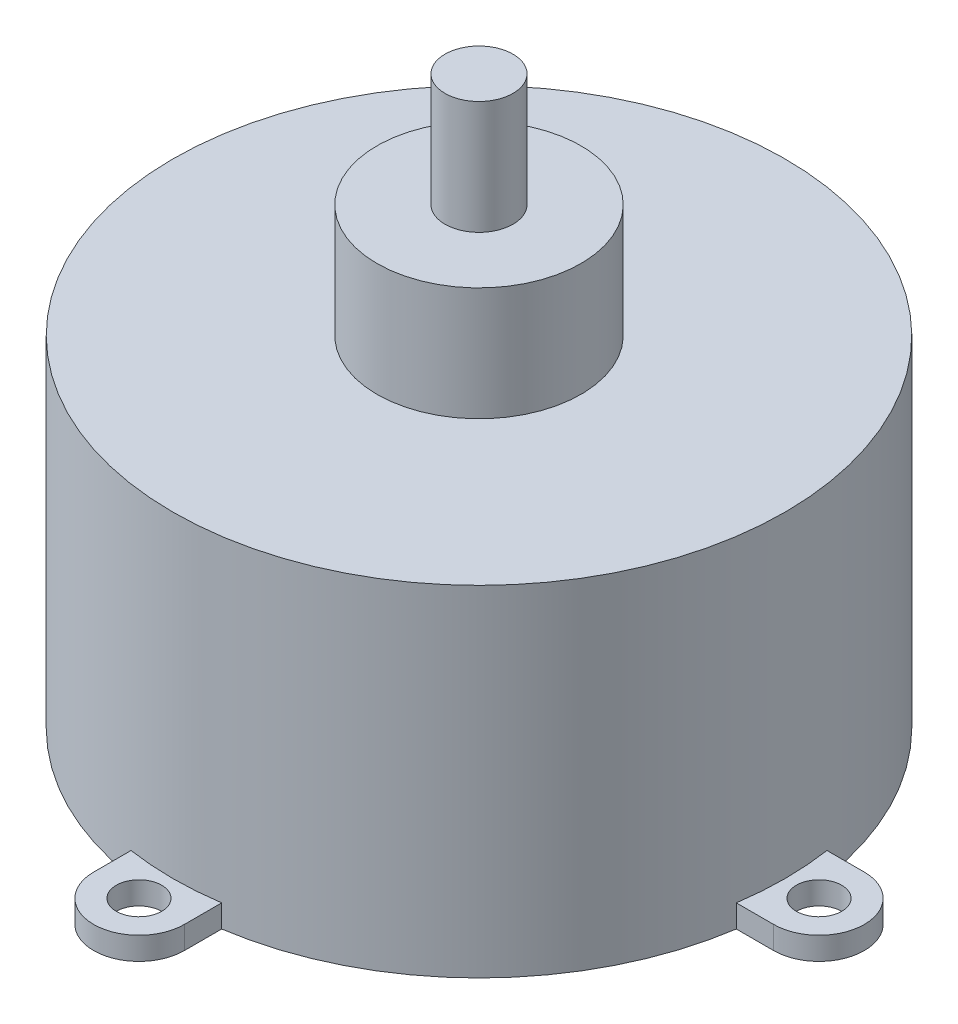
ISO-10303-21;
HEADER;
FILE_DESCRIPTION(('STEP AP214'),'2;1');
FILE_NAME('part.step','',(''),(''),'','','');
FILE_SCHEMA(('AUTOMOTIVE_DESIGN { 1 0 10303 214 1 1 1 1 }'));
ENDSEC;
DATA;
#1=APPLICATION_CONTEXT('core data for automotive mechanical design processes');
#2=APPLICATION_PROTOCOL_DEFINITION('international standard','automotive_design',2000,#1);
#3=PRODUCT_CONTEXT('',#1,'mechanical');
#4=PRODUCT('Part','Part','',(#3));
#5=PRODUCT_RELATED_PRODUCT_CATEGORY('part','',(#4));
#6=PRODUCT_DEFINITION_FORMATION('','',#4);
#7=PRODUCT_DEFINITION_CONTEXT('part definition',#1,'design');
#8=PRODUCT_DEFINITION('design','',#6,#7);
#9=PRODUCT_DEFINITION_SHAPE('','',#8);
#10=(LENGTH_UNIT() NAMED_UNIT(*) SI_UNIT(.MILLI.,.METRE.));
#11=(NAMED_UNIT(*) PLANE_ANGLE_UNIT() SI_UNIT($,.RADIAN.));
#12=(NAMED_UNIT(*) SI_UNIT($,.STERADIAN.) SOLID_ANGLE_UNIT());
#13=UNCERTAINTY_MEASURE_WITH_UNIT(LENGTH_MEASURE(1.E-05),#10,'distance_accuracy_value','');
#14=(GEOMETRIC_REPRESENTATION_CONTEXT(3) GLOBAL_UNCERTAINTY_ASSIGNED_CONTEXT((#13)) GLOBAL_UNIT_ASSIGNED_CONTEXT((#10,
#11,#12)) REPRESENTATION_CONTEXT('',''));
#15=CARTESIAN_POINT('',(0.,0.,0.));
#16=DIRECTION('',(0.,0.,1.));
#17=DIRECTION('',(1.,0.,0.));
#18=AXIS2_PLACEMENT_3D('',#15,#16,#17);
#19=CARTESIAN_POINT('',(0.,25.,0.));
#20=DIRECTION('',(0.,-1.,0.));
#21=DIRECTION('',(0.,0.,-1.));
#22=AXIS2_PLACEMENT_3D('',#19,#20,#21);
#23=CYLINDRICAL_SURFACE('',#22,1.5);
#24=CARTESIAN_POINT('',(0.,20.,0.));
#25=DIRECTION('',(0.,1.,0.));
#26=DIRECTION('',(0.,0.,1.));
#27=AXIS2_PLACEMENT_3D('',#24,#25,#26);
#28=CIRCLE('',#27,1.5);
#29=CARTESIAN_POINT('',(0.,20.,1.5));
#30=VERTEX_POINT('',#29);
#31=EDGE_CURVE('E302',#30,#30,#28,.T.);
#32=ORIENTED_EDGE('',*,*,#31,.T.);
#33=EDGE_LOOP('',(#32));
#34=FACE_BOUND('',#33,.T.);
#35=CARTESIAN_POINT('',(0.,25.,0.));
#36=DIRECTION('',(0.,1.,0.));
#37=DIRECTION('',(0.,0.,1.));
#38=AXIS2_PLACEMENT_3D('',#35,#36,#37);
#39=CIRCLE('',#38,1.5);
#40=CARTESIAN_POINT('',(0.,25.,1.5));
#41=VERTEX_POINT('',#40);
#42=EDGE_CURVE('E11',#41,#41,#39,.T.);
#43=ORIENTED_EDGE('',*,*,#42,.F.);
#44=EDGE_LOOP('',(#43));
#45=FACE_BOUND('',#44,.T.);
#46=ADVANCED_FACE('F37',(#34,#45),#23,.T.);
#47=CARTESIAN_POINT('',(0.,25.,0.));
#48=DIRECTION('',(0.,1.,0.));
#49=DIRECTION('',(0.,0.,1.));
#50=AXIS2_PLACEMENT_3D('',#47,#48,#49);
#51=PLANE('',#50);
#52=ORIENTED_EDGE('',*,*,#42,.T.);
#53=EDGE_LOOP('',(#52));
#54=FACE_BOUND('',#53,.T.);
#55=ADVANCED_FACE('F313',(#54),#51,.T.);
#56=CARTESIAN_POINT('',(0.,20.,0.));
#57=DIRECTION('',(0.,-1.,0.));
#58=DIRECTION('',(0.,0.,-1.));
#59=AXIS2_PLACEMENT_3D('',#56,#57,#58);
#60=CYLINDRICAL_SURFACE('',#59,4.5);
#61=CARTESIAN_POINT('',(0.,15.,0.));
#62=DIRECTION('',(0.,1.,0.));
#63=DIRECTION('',(0.,0.,1.));
#64=AXIS2_PLACEMENT_3D('',#61,#62,#63);
#65=CIRCLE('',#64,4.5);
#66=CARTESIAN_POINT('',(0.,15.,4.5));
#67=VERTEX_POINT('',#66);
#68=EDGE_CURVE('E298',#67,#67,#65,.T.);
#69=ORIENTED_EDGE('',*,*,#68,.T.);
#70=EDGE_LOOP('',(#69));
#71=FACE_BOUND('',#70,.T.);
#72=CARTESIAN_POINT('',(0.,20.,0.));
#73=DIRECTION('',(0.,1.,0.));
#74=DIRECTION('',(0.,0.,1.));
#75=AXIS2_PLACEMENT_3D('',#72,#73,#74);
#76=CIRCLE('',#75,4.5);
#77=CARTESIAN_POINT('',(0.,20.,4.5));
#78=VERTEX_POINT('',#77);
#79=EDGE_CURVE('E44',#78,#78,#76,.T.);
#80=ORIENTED_EDGE('',*,*,#79,.F.);
#81=EDGE_LOOP('',(#80));
#82=FACE_BOUND('',#81,.T.);
#83=ADVANCED_FACE('F311',(#71,#82),#60,.T.);
#84=CARTESIAN_POINT('',(0.,20.,0.));
#85=DIRECTION('',(0.,1.,0.));
#86=DIRECTION('',(0.,0.,1.));
#87=AXIS2_PLACEMENT_3D('',#84,#85,#86);
#88=PLANE('',#87);
#89=ORIENTED_EDGE('',*,*,#31,.F.);
#90=EDGE_LOOP('',(#89));
#91=FACE_BOUND('',#90,.T.);
#92=ORIENTED_EDGE('',*,*,#79,.T.);
#93=EDGE_LOOP('',(#92));
#94=FACE_BOUND('',#93,.T.);
#95=ADVANCED_FACE('F309',(#91,#94),#88,.T.);
#96=CARTESIAN_POINT('',(0.,15.,0.));
#97=DIRECTION('',(0.,-1.,0.));
#98=DIRECTION('',(0.,0.,-1.));
#99=AXIS2_PLACEMENT_3D('',#96,#97,#98);
#100=CYLINDRICAL_SURFACE('',#99,13.5);
#101=CARTESIAN_POINT('',(0.,15.,0.));
#102=DIRECTION('',(0.,1.,0.));
#103=DIRECTION('',(0.,0.,1.));
#104=AXIS2_PLACEMENT_3D('',#101,#102,#103);
#105=CIRCLE('',#104,13.5);
#106=CARTESIAN_POINT('',(0.,15.,13.5));
#107=VERTEX_POINT('',#106);
#108=EDGE_CURVE('E295',#107,#107,#105,.T.);
#109=ORIENTED_EDGE('',*,*,#108,.F.);
#110=EDGE_LOOP('',(#109));
#111=FACE_BOUND('',#110,.T.);
#112=CARTESIAN_POINT('',(0.,0.,0.));
#113=DIRECTION('',(0.,1.,0.));
#114=DIRECTION('',(0.,0.,1.));
#115=AXIS2_PLACEMENT_3D('',#112,#113,#114);
#116=CIRCLE('',#115,13.5);
#117=CARTESIAN_POINT('',(13.3510299228187,0.,-1.99999999999995));
#118=VERTEX_POINT('',#117);
#119=CARTESIAN_POINT('',(2.,0.,-13.3510299228187));
#120=VERTEX_POINT('',#119);
#121=EDGE_CURVE('E625',#118,#120,#116,.T.);
#122=ORIENTED_EDGE('',*,*,#121,.T.);
#123=DIRECTION('',(0.,-1.,0.));
#124=VECTOR('',#123,1.);
#125=CARTESIAN_POINT('',(2.,1.,-13.3510299228187));
#126=LINE('',#125,#124);
#127=CARTESIAN_POINT('',(2.,1.,-13.3510299228187));
#128=VERTEX_POINT('',#127);
#129=EDGE_CURVE('E56',#128,#120,#126,.T.);
#130=ORIENTED_EDGE('',*,*,#129,.F.);
#131=CARTESIAN_POINT('',(0.,1.,0.));
#132=DIRECTION('',(0.,1.,0.));
#133=DIRECTION('',(0.,0.,1.));
#134=AXIS2_PLACEMENT_3D('',#131,#132,#133);
#135=CIRCLE('',#134,13.5);
#136=CARTESIAN_POINT('',(-2.,1.,-13.3510299228187));
#137=VERTEX_POINT('',#136);
#138=EDGE_CURVE('E51',#128,#137,#135,.T.);
#139=ORIENTED_EDGE('',*,*,#138,.T.);
#140=DIRECTION('',(0.,-1.,0.));
#141=VECTOR('',#140,1.);
#142=CARTESIAN_POINT('',(-2.,1.,-13.3510299228187));
#143=LINE('',#142,#141);
#144=CARTESIAN_POINT('',(-2.,0.,-13.3510299228187));
#145=VERTEX_POINT('',#144);
#146=EDGE_CURVE('E177',#137,#145,#143,.T.);
#147=ORIENTED_EDGE('',*,*,#146,.T.);
#148=CARTESIAN_POINT('',(-13.3510299228187,0.,-2.00000000000014));
#149=VERTEX_POINT('',#148);
#150=EDGE_CURVE('E294',#145,#149,#116,.T.);
#151=ORIENTED_EDGE('',*,*,#150,.T.);
#152=DIRECTION('',(0.,-1.,0.));
#153=VECTOR('',#152,1.);
#154=CARTESIAN_POINT('',(-13.3510299228187,1.,-2.00000000000014));
#155=LINE('',#154,#153);
#156=CARTESIAN_POINT('',(-13.3510299228187,1.,-2.00000000000014));
#157=VERTEX_POINT('',#156);
#158=EDGE_CURVE('E291',#157,#149,#155,.T.);
#159=ORIENTED_EDGE('',*,*,#158,.F.);
#160=CARTESIAN_POINT('',(0.,1.,0.));
#161=DIRECTION('',(0.,1.,0.));
#162=DIRECTION('',(0.,0.,1.));
#163=AXIS2_PLACEMENT_3D('',#160,#161,#162);
#164=CIRCLE('',#163,13.5);
#165=CARTESIAN_POINT('',(-13.3510299228187,1.,1.99999999999986));
#166=VERTEX_POINT('',#165);
#167=EDGE_CURVE('E260',#157,#166,#164,.T.);
#168=ORIENTED_EDGE('',*,*,#167,.T.);
#169=DIRECTION('',(0.,-1.,0.));
#170=VECTOR('',#169,1.);
#171=CARTESIAN_POINT('',(-13.3510299228187,1.,1.99999999999986));
#172=LINE('',#171,#170);
#173=CARTESIAN_POINT('',(-13.3510299228187,0.,1.99999999999986));
#174=VERTEX_POINT('',#173);
#175=EDGE_CURVE('E274',#166,#174,#172,.T.);
#176=ORIENTED_EDGE('',*,*,#175,.T.);
#177=CARTESIAN_POINT('',(-2.00000000000009,0.,13.3510299228187));
#178=VERTEX_POINT('',#177);
#179=EDGE_CURVE('E299',#174,#178,#116,.T.);
#180=ORIENTED_EDGE('',*,*,#179,.T.);
#181=DIRECTION('',(0.,-1.,0.));
#182=VECTOR('',#181,1.);
#183=CARTESIAN_POINT('',(-2.00000000000009,1.,13.3510299228187));
#184=LINE('',#183,#182);
#185=CARTESIAN_POINT('',(-2.00000000000009,1.,13.3510299228187));
#186=VERTEX_POINT('',#185);
#187=EDGE_CURVE('E256',#186,#178,#184,.T.);
#188=ORIENTED_EDGE('',*,*,#187,.F.);
#189=CARTESIAN_POINT('',(0.,1.,0.));
#190=DIRECTION('',(0.,1.,0.));
#191=DIRECTION('',(0.,0.,1.));
#192=AXIS2_PLACEMENT_3D('',#189,#190,#191);
#193=CIRCLE('',#192,13.5);
#194=CARTESIAN_POINT('',(1.99999999999991,1.,13.3510299228187));
#195=VERTEX_POINT('',#194);
#196=EDGE_CURVE('E225',#186,#195,#193,.T.);
#197=ORIENTED_EDGE('',*,*,#196,.T.);
#198=DIRECTION('',(0.,-1.,0.));
#199=VECTOR('',#198,1.);
#200=CARTESIAN_POINT('',(1.99999999999991,1.,13.3510299228187));
#201=LINE('',#200,#199);
#202=CARTESIAN_POINT('',(1.99999999999991,0.,13.3510299228187));
#203=VERTEX_POINT('',#202);
#204=EDGE_CURVE('E239',#195,#203,#201,.T.);
#205=ORIENTED_EDGE('',*,*,#204,.T.);
#206=CARTESIAN_POINT('',(13.3510299228187,0.,2.00000000000005));
#207=VERTEX_POINT('',#206);
#208=EDGE_CURVE('E304',#203,#207,#116,.T.);
#209=ORIENTED_EDGE('',*,*,#208,.T.);
#210=DIRECTION('',(0.,-1.,0.));
#211=VECTOR('',#210,1.);
#212=CARTESIAN_POINT('',(13.3510299228187,1.,2.00000000000005));
#213=LINE('',#212,#211);
#214=CARTESIAN_POINT('',(13.3510299228187,1.,2.00000000000005));
#215=VERTEX_POINT('',#214);
#216=EDGE_CURVE('E221',#215,#207,#213,.T.);
#217=ORIENTED_EDGE('',*,*,#216,.F.);
#218=CARTESIAN_POINT('',(0.,1.,0.));
#219=DIRECTION('',(0.,1.,0.));
#220=DIRECTION('',(0.,0.,1.));
#221=AXIS2_PLACEMENT_3D('',#218,#219,#220);
#222=CIRCLE('',#221,13.5);
#223=CARTESIAN_POINT('',(13.3510299228187,1.,-1.99999999999995));
#224=VERTEX_POINT('',#223);
#225=EDGE_CURVE('E190',#215,#224,#222,.T.);
#226=ORIENTED_EDGE('',*,*,#225,.T.);
#227=DIRECTION('',(0.,-1.,0.));
#228=VECTOR('',#227,1.);
#229=CARTESIAN_POINT('',(13.3510299228187,1.,-1.99999999999995));
#230=LINE('',#229,#228);
#231=EDGE_CURVE('E204',#224,#118,#230,.T.);
#232=ORIENTED_EDGE('',*,*,#231,.T.);
#233=EDGE_LOOP('',(#122,#130,#139,#147,#151,#159,#168,#176,#180,#188,#197,#205,#209,#217,#226,#232));
#234=FACE_BOUND('',#233,.T.);
#235=ADVANCED_FACE('F320',(#111,#234),#100,.T.);
#236=CARTESIAN_POINT('',(0.,15.,0.));
#237=DIRECTION('',(0.,1.,0.));
#238=DIRECTION('',(0.,0.,1.));
#239=AXIS2_PLACEMENT_3D('',#236,#237,#238);
#240=PLANE('',#239);
#241=ORIENTED_EDGE('',*,*,#108,.T.);
#242=EDGE_LOOP('',(#241));
#243=FACE_BOUND('',#242,.T.);
#244=ORIENTED_EDGE('',*,*,#68,.F.);
#245=EDGE_LOOP('',(#244));
#246=FACE_BOUND('',#245,.T.);
#247=ADVANCED_FACE('F351',(#243,#246),#240,.T.);
#248=CARTESIAN_POINT('',(0.,0.,0.));
#249=DIRECTION('',(0.,1.,0.));
#250=DIRECTION('',(0.,0.,1.));
#251=AXIS2_PLACEMENT_3D('',#248,#249,#250);
#252=PLANE('',#251);
#253=ORIENTED_EDGE('',*,*,#179,.F.);
#254=DIRECTION('',(1.,0.,0.));
#255=VECTOR('',#254,1.);
#256=CARTESIAN_POINT('',(0.,0.,2.));
#257=LINE('',#256,#255);
#258=CARTESIAN_POINT('',(-15.,0.,1.99999999999984));
#259=VERTEX_POINT('',#258);
#260=EDGE_CURVE('E279',#259,#174,#257,.T.);
#261=ORIENTED_EDGE('',*,*,#260,.F.);
#262=CARTESIAN_POINT('',(-15.,0.,-1.55381936771964E-13));
#263=DIRECTION('',(0.,1.,0.));
#264=DIRECTION('',(0.,0.,1.));
#265=AXIS2_PLACEMENT_3D('',#262,#263,#264);
#266=CIRCLE('',#265,2.);
#267=CARTESIAN_POINT('',(-15.,0.,-2.00000000000016));
#268=VERTEX_POINT('',#267);
#269=EDGE_CURVE('E277',#268,#259,#266,.T.);
#270=ORIENTED_EDGE('',*,*,#269,.F.);
#271=DIRECTION('',(1.,0.,0.));
#272=VECTOR('',#271,1.);
#273=CARTESIAN_POINT('',(0.,0.,-2.));
#274=LINE('',#273,#272);
#275=EDGE_CURVE('E259',#268,#149,#274,.T.);
#276=ORIENTED_EDGE('',*,*,#275,.T.);
#277=ORIENTED_EDGE('',*,*,#150,.F.);
#278=DIRECTION('',(0.,0.,1.));
#279=VECTOR('',#278,1.);
#280=CARTESIAN_POINT('',(-2.,0.,0.));
#281=LINE('',#280,#279);
#282=CARTESIAN_POINT('',(-2.,0.,-15.));
#283=VERTEX_POINT('',#282);
#284=EDGE_CURVE('E181',#283,#145,#281,.T.);
#285=ORIENTED_EDGE('',*,*,#284,.F.);
#286=CARTESIAN_POINT('',(0.,0.,-15.));
#287=DIRECTION('',(0.,1.,0.));
#288=DIRECTION('',(0.,0.,1.));
#289=AXIS2_PLACEMENT_3D('',#286,#287,#288);
#290=CIRCLE('',#289,2.);
#291=CARTESIAN_POINT('',(2.,0.,-15.));
#292=VERTEX_POINT('',#291);
#293=EDGE_CURVE('E179',#292,#283,#290,.T.);
#294=ORIENTED_EDGE('',*,*,#293,.F.);
#295=DIRECTION('',(0.,0.,1.));
#296=VECTOR('',#295,1.);
#297=CARTESIAN_POINT('',(2.,0.,0.));
#298=LINE('',#297,#296);
#299=EDGE_CURVE('E154',#292,#120,#298,.T.);
#300=ORIENTED_EDGE('',*,*,#299,.T.);
#301=ORIENTED_EDGE('',*,*,#121,.F.);
#302=DIRECTION('',(-1.,0.,0.));
#303=VECTOR('',#302,1.);
#304=CARTESIAN_POINT('',(0.,0.,-2.));
#305=LINE('',#304,#303);
#306=CARTESIAN_POINT('',(15.,0.,-1.99999999999995));
#307=VERTEX_POINT('',#306);
#308=EDGE_CURVE('E209',#307,#118,#305,.T.);
#309=ORIENTED_EDGE('',*,*,#308,.F.);
#310=CARTESIAN_POINT('',(15.,0.,0.));
#311=DIRECTION('',(0.,1.,0.));
#312=DIRECTION('',(0.,0.,1.));
#313=AXIS2_PLACEMENT_3D('',#310,#311,#312);
#314=CIRCLE('',#313,2.);
#315=CARTESIAN_POINT('',(15.,0.,2.00000000000005));
#316=VERTEX_POINT('',#315);
#317=EDGE_CURVE('E207',#316,#307,#314,.T.);
#318=ORIENTED_EDGE('',*,*,#317,.F.);
#319=DIRECTION('',(-1.,0.,0.));
#320=VECTOR('',#319,1.);
#321=CARTESIAN_POINT('',(0.,0.,2.));
#322=LINE('',#321,#320);
#323=EDGE_CURVE('E189',#316,#207,#322,.T.);
#324=ORIENTED_EDGE('',*,*,#323,.T.);
#325=ORIENTED_EDGE('',*,*,#208,.F.);
#326=DIRECTION('',(0.,0.,-1.));
#327=VECTOR('',#326,1.);
#328=CARTESIAN_POINT('',(2.,0.,0.));
#329=LINE('',#328,#327);
#330=CARTESIAN_POINT('',(1.9999999999999,0.,15.));
#331=VERTEX_POINT('',#330);
#332=EDGE_CURVE('E244',#331,#203,#329,.T.);
#333=ORIENTED_EDGE('',*,*,#332,.F.);
#334=CARTESIAN_POINT('',(-1.04744440165294E-13,0.,15.));
#335=DIRECTION('',(0.,1.,0.));
#336=DIRECTION('',(0.,0.,1.));
#337=AXIS2_PLACEMENT_3D('',#334,#335,#336);
#338=CIRCLE('',#337,2.);
#339=CARTESIAN_POINT('',(-2.0000000000001,0.,15.));
#340=VERTEX_POINT('',#339);
#341=EDGE_CURVE('E242',#340,#331,#338,.T.);
#342=ORIENTED_EDGE('',*,*,#341,.F.);
#343=DIRECTION('',(0.,0.,-1.));
#344=VECTOR('',#343,1.);
#345=CARTESIAN_POINT('',(-2.,0.,0.));
#346=LINE('',#345,#344);
#347=EDGE_CURVE('E224',#340,#178,#346,.T.);
#348=ORIENTED_EDGE('',*,*,#347,.T.);
#349=EDGE_LOOP('',(#253,#261,#270,#276,#277,#285,#294,#300,#301,#309,#318,#324,#325,#333,#342,#348));
#350=FACE_BOUND('',#349,.T.);
#351=CARTESIAN_POINT('',(-15.,0.,-1.55381936771964E-13));
#352=DIRECTION('',(0.,1.,0.));
#353=DIRECTION('',(0.,0.,1.));
#354=AXIS2_PLACEMENT_3D('',#351,#352,#353);
#355=CIRCLE('',#354,1.);
#356=CARTESIAN_POINT('',(-15.,0.,0.999999999999845));
#357=VERTEX_POINT('',#356);
#358=EDGE_CURVE('E263',#357,#357,#355,.T.);
#359=ORIENTED_EDGE('',*,*,#358,.T.);
#360=EDGE_LOOP('',(#359));
#361=FACE_BOUND('',#360,.T.);
#362=CARTESIAN_POINT('',(-1.04744440165294E-13,0.,15.));
#363=DIRECTION('',(0.,1.,0.));
#364=DIRECTION('',(0.,0.,1.));
#365=AXIS2_PLACEMENT_3D('',#362,#363,#364);
#366=CIRCLE('',#365,1.);
#367=CARTESIAN_POINT('',(-1.04744440165294E-13,0.,16.));
#368=VERTEX_POINT('',#367);
#369=EDGE_CURVE('E228',#368,#368,#366,.T.);
#370=ORIENTED_EDGE('',*,*,#369,.T.);
#371=EDGE_LOOP('',(#370));
#372=FACE_BOUND('',#371,.T.);
#373=CARTESIAN_POINT('',(15.,0.,0.));
#374=DIRECTION('',(0.,1.,0.));
#375=DIRECTION('',(0.,0.,1.));
#376=AXIS2_PLACEMENT_3D('',#373,#374,#375);
#377=CIRCLE('',#376,1.);
#378=CARTESIAN_POINT('',(15.,0.,1.00000000000005));
#379=VERTEX_POINT('',#378);
#380=EDGE_CURVE('E193',#379,#379,#377,.T.);
#381=ORIENTED_EDGE('',*,*,#380,.T.);
#382=EDGE_LOOP('',(#381));
#383=FACE_BOUND('',#382,.T.);
#384=CARTESIAN_POINT('',(0.,0.,-15.));
#385=DIRECTION('',(0.,1.,0.));
#386=DIRECTION('',(0.,0.,1.));
#387=AXIS2_PLACEMENT_3D('',#384,#385,#386);
#388=CIRCLE('',#387,1.);
#389=CARTESIAN_POINT('',(0.,0.,-14.));
#390=VERTEX_POINT('',#389);
#391=EDGE_CURVE('E170',#390,#390,#388,.T.);
#392=ORIENTED_EDGE('',*,*,#391,.T.);
#393=EDGE_LOOP('',(#392));
#394=FACE_BOUND('',#393,.T.);
#395=ADVANCED_FACE('F344',(#350,#361,#372,#383,#394),#252,.F.);
#396=CARTESIAN_POINT('',(0.,1.,-2.));
#397=DIRECTION('',(0.,0.,-1.));
#398=DIRECTION('',(-1.,0.,0.));
#399=AXIS2_PLACEMENT_3D('',#396,#397,#398);
#400=PLANE('',#399);
#401=ORIENTED_EDGE('',*,*,#275,.F.);
#402=DIRECTION('',(0.,-1.,0.));
#403=VECTOR('',#402,1.);
#404=CARTESIAN_POINT('',(-15.,1.,-2.00000000000016));
#405=LINE('',#404,#403);
#406=CARTESIAN_POINT('',(-15.,1.,-2.00000000000016));
#407=VERTEX_POINT('',#406);
#408=EDGE_CURVE('E289',#407,#268,#405,.T.);
#409=ORIENTED_EDGE('',*,*,#408,.F.);
#410=DIRECTION('',(1.,0.,0.));
#411=VECTOR('',#410,1.);
#412=CARTESIAN_POINT('',(0.,1.,-2.));
#413=LINE('',#412,#411);
#414=EDGE_CURVE('E262',#407,#157,#413,.T.);
#415=ORIENTED_EDGE('',*,*,#414,.T.);
#416=ORIENTED_EDGE('',*,*,#158,.T.);
#417=EDGE_LOOP('',(#401,#409,#415,#416));
#418=FACE_BOUND('',#417,.T.);
#419=ADVANCED_FACE('F350',(#418),#400,.T.);
#420=CARTESIAN_POINT('',(-15.,1.,-1.55381936771964E-13));
#421=DIRECTION('',(0.,-1.,0.));
#422=DIRECTION('',(0.,0.,-1.));
#423=AXIS2_PLACEMENT_3D('',#420,#421,#422);
#424=CYLINDRICAL_SURFACE('',#423,2.);
#425=ORIENTED_EDGE('',*,*,#269,.T.);
#426=DIRECTION('',(0.,-1.,0.));
#427=VECTOR('',#426,1.);
#428=CARTESIAN_POINT('',(-15.,1.,1.99999999999984));
#429=LINE('',#428,#427);
#430=CARTESIAN_POINT('',(-15.,1.,1.99999999999984));
#431=VERTEX_POINT('',#430);
#432=EDGE_CURVE('E286',#431,#259,#429,.T.);
#433=ORIENTED_EDGE('',*,*,#432,.F.);
#434=CARTESIAN_POINT('',(-15.,1.,-1.55381936771964E-13));
#435=DIRECTION('',(0.,1.,0.));
#436=DIRECTION('',(0.,0.,1.));
#437=AXIS2_PLACEMENT_3D('',#434,#435,#436);
#438=CIRCLE('',#437,2.);
#439=EDGE_CURVE('E266',#407,#431,#438,.T.);
#440=ORIENTED_EDGE('',*,*,#439,.F.);
#441=ORIENTED_EDGE('',*,*,#408,.T.);
#442=EDGE_LOOP('',(#425,#433,#440,#441));
#443=FACE_BOUND('',#442,.T.);
#444=ADVANCED_FACE('F386',(#443),#424,.T.);
#445=CARTESIAN_POINT('',(0.,1.,2.));
#446=DIRECTION('',(0.,0.,-1.));
#447=DIRECTION('',(-1.,0.,0.));
#448=AXIS2_PLACEMENT_3D('',#445,#446,#447);
#449=PLANE('',#448);
#450=ORIENTED_EDGE('',*,*,#260,.T.);
#451=ORIENTED_EDGE('',*,*,#175,.F.);
#452=DIRECTION('',(1.,0.,0.));
#453=VECTOR('',#452,1.);
#454=CARTESIAN_POINT('',(0.,1.,2.));
#455=LINE('',#454,#453);
#456=EDGE_CURVE('E268',#431,#166,#455,.T.);
#457=ORIENTED_EDGE('',*,*,#456,.F.);
#458=ORIENTED_EDGE('',*,*,#432,.T.);
#459=EDGE_LOOP('',(#450,#451,#457,#458));
#460=FACE_BOUND('',#459,.T.);
#461=ADVANCED_FACE('F394',(#460),#449,.F.);
#462=CARTESIAN_POINT('',(-15.,1.,-1.55381936771964E-13));
#463=DIRECTION('',(0.,-1.,0.));
#464=DIRECTION('',(0.,0.,-1.));
#465=AXIS2_PLACEMENT_3D('',#462,#463,#464);
#466=CYLINDRICAL_SURFACE('',#465,1.);
#467=CARTESIAN_POINT('',(-15.,1.,-1.55381936771964E-13));
#468=DIRECTION('',(0.,1.,0.));
#469=DIRECTION('',(0.,0.,1.));
#470=AXIS2_PLACEMENT_3D('',#467,#468,#469);
#471=CIRCLE('',#470,1.);
#472=CARTESIAN_POINT('',(-15.,1.,0.999999999999845));
#473=VERTEX_POINT('',#472);
#474=EDGE_CURVE('E271',#473,#473,#471,.T.);
#475=ORIENTED_EDGE('',*,*,#474,.T.);
#476=EDGE_LOOP('',(#475));
#477=FACE_BOUND('',#476,.T.);
#478=ORIENTED_EDGE('',*,*,#358,.F.);
#479=EDGE_LOOP('',(#478));
#480=FACE_BOUND('',#479,.T.);
#481=ADVANCED_FACE('F402',(#477,#480),#466,.F.);
#482=CARTESIAN_POINT('',(0.,1.,0.));
#483=DIRECTION('',(0.,1.,0.));
#484=DIRECTION('',(0.,0.,1.));
#485=AXIS2_PLACEMENT_3D('',#482,#483,#484);
#486=PLANE('',#485);
#487=ORIENTED_EDGE('',*,*,#167,.F.);
#488=ORIENTED_EDGE('',*,*,#414,.F.);
#489=ORIENTED_EDGE('',*,*,#439,.T.);
#490=ORIENTED_EDGE('',*,*,#456,.T.);
#491=EDGE_LOOP('',(#487,#488,#489,#490));
#492=FACE_BOUND('',#491,.T.);
#493=ORIENTED_EDGE('',*,*,#474,.F.);
#494=EDGE_LOOP('',(#493));
#495=FACE_BOUND('',#494,.T.);
#496=ADVANCED_FACE('F410',(#492,#495),#486,.T.);
#497=CARTESIAN_POINT('',(-2.,1.,0.));
#498=DIRECTION('',(-1.,0.,0.));
#499=DIRECTION('',(0.,0.,1.));
#500=AXIS2_PLACEMENT_3D('',#497,#498,#499);
#501=PLANE('',#500);
#502=ORIENTED_EDGE('',*,*,#347,.F.);
#503=DIRECTION('',(0.,-1.,0.));
#504=VECTOR('',#503,1.);
#505=CARTESIAN_POINT('',(-2.0000000000001,1.,15.));
#506=LINE('',#505,#504);
#507=CARTESIAN_POINT('',(-2.0000000000001,1.,15.));
#508=VERTEX_POINT('',#507);
#509=EDGE_CURVE('E254',#508,#340,#506,.T.);
#510=ORIENTED_EDGE('',*,*,#509,.F.);
#511=DIRECTION('',(0.,0.,-1.));
#512=VECTOR('',#511,1.);
#513=CARTESIAN_POINT('',(-2.,1.,0.));
#514=LINE('',#513,#512);
#515=EDGE_CURVE('E227',#508,#186,#514,.T.);
#516=ORIENTED_EDGE('',*,*,#515,.T.);
#517=ORIENTED_EDGE('',*,*,#187,.T.);
#518=EDGE_LOOP('',(#502,#510,#516,#517));
#519=FACE_BOUND('',#518,.T.);
#520=ADVANCED_FACE('F418',(#519),#501,.T.);
#521=CARTESIAN_POINT('',(-1.04744440165294E-13,1.,15.));
#522=DIRECTION('',(0.,-1.,0.));
#523=DIRECTION('',(0.,0.,-1.));
#524=AXIS2_PLACEMENT_3D('',#521,#522,#523);
#525=CYLINDRICAL_SURFACE('',#524,2.);
#526=ORIENTED_EDGE('',*,*,#341,.T.);
#527=DIRECTION('',(0.,-1.,0.));
#528=VECTOR('',#527,1.);
#529=CARTESIAN_POINT('',(1.9999999999999,1.,15.));
#530=LINE('',#529,#528);
#531=CARTESIAN_POINT('',(1.9999999999999,1.,15.));
#532=VERTEX_POINT('',#531);
#533=EDGE_CURVE('E251',#532,#331,#530,.T.);
#534=ORIENTED_EDGE('',*,*,#533,.F.);
#535=CARTESIAN_POINT('',(-1.04744440165294E-13,1.,15.));
#536=DIRECTION('',(0.,1.,0.));
#537=DIRECTION('',(0.,0.,1.));
#538=AXIS2_PLACEMENT_3D('',#535,#536,#537);
#539=CIRCLE('',#538,2.);
#540=EDGE_CURVE('E231',#508,#532,#539,.T.);
#541=ORIENTED_EDGE('',*,*,#540,.F.);
#542=ORIENTED_EDGE('',*,*,#509,.T.);
#543=EDGE_LOOP('',(#526,#534,#541,#542));
#544=FACE_BOUND('',#543,.T.);
#545=ADVANCED_FACE('F426',(#544),#525,.T.);
#546=CARTESIAN_POINT('',(2.,1.,0.));
#547=DIRECTION('',(-1.,0.,0.));
#548=DIRECTION('',(0.,0.,1.));
#549=AXIS2_PLACEMENT_3D('',#546,#547,#548);
#550=PLANE('',#549);
#551=ORIENTED_EDGE('',*,*,#332,.T.);
#552=ORIENTED_EDGE('',*,*,#204,.F.);
#553=DIRECTION('',(0.,0.,-1.));
#554=VECTOR('',#553,1.);
#555=CARTESIAN_POINT('',(2.,1.,0.));
#556=LINE('',#555,#554);
#557=EDGE_CURVE('E233',#532,#195,#556,.T.);
#558=ORIENTED_EDGE('',*,*,#557,.F.);
#559=ORIENTED_EDGE('',*,*,#533,.T.);
#560=EDGE_LOOP('',(#551,#552,#558,#559));
#561=FACE_BOUND('',#560,.T.);
#562=ADVANCED_FACE('F434',(#561),#550,.F.);
#563=CARTESIAN_POINT('',(-1.04744440165294E-13,1.,15.));
#564=DIRECTION('',(0.,-1.,0.));
#565=DIRECTION('',(0.,0.,-1.));
#566=AXIS2_PLACEMENT_3D('',#563,#564,#565);
#567=CYLINDRICAL_SURFACE('',#566,1.);
#568=CARTESIAN_POINT('',(-1.04744440165294E-13,1.,15.));
#569=DIRECTION('',(0.,1.,0.));
#570=DIRECTION('',(0.,0.,1.));
#571=AXIS2_PLACEMENT_3D('',#568,#569,#570);
#572=CIRCLE('',#571,1.);
#573=CARTESIAN_POINT('',(-1.04744440165294E-13,1.,16.));
#574=VERTEX_POINT('',#573);
#575=EDGE_CURVE('E236',#574,#574,#572,.T.);
#576=ORIENTED_EDGE('',*,*,#575,.T.);
#577=EDGE_LOOP('',(#576));
#578=FACE_BOUND('',#577,.T.);
#579=ORIENTED_EDGE('',*,*,#369,.F.);
#580=EDGE_LOOP('',(#579));
#581=FACE_BOUND('',#580,.T.);
#582=ADVANCED_FACE('F442',(#578,#581),#567,.F.);
#583=CARTESIAN_POINT('',(0.,1.,0.));
#584=DIRECTION('',(0.,1.,0.));
#585=DIRECTION('',(0.,0.,1.));
#586=AXIS2_PLACEMENT_3D('',#583,#584,#585);
#587=PLANE('',#586);
#588=ORIENTED_EDGE('',*,*,#196,.F.);
#589=ORIENTED_EDGE('',*,*,#515,.F.);
#590=ORIENTED_EDGE('',*,*,#540,.T.);
#591=ORIENTED_EDGE('',*,*,#557,.T.);
#592=EDGE_LOOP('',(#588,#589,#590,#591));
#593=FACE_BOUND('',#592,.T.);
#594=ORIENTED_EDGE('',*,*,#575,.F.);
#595=EDGE_LOOP('',(#594));
#596=FACE_BOUND('',#595,.T.);
#597=ADVANCED_FACE('F450',(#593,#596),#587,.T.);
#598=CARTESIAN_POINT('',(0.,1.,2.));
#599=DIRECTION('',(0.,0.,1.));
#600=DIRECTION('',(1.,0.,0.));
#601=AXIS2_PLACEMENT_3D('',#598,#599,#600);
#602=PLANE('',#601);
#603=ORIENTED_EDGE('',*,*,#323,.F.);
#604=DIRECTION('',(0.,-1.,0.));
#605=VECTOR('',#604,1.);
#606=CARTESIAN_POINT('',(15.,1.,2.00000000000005));
#607=LINE('',#606,#605);
#608=CARTESIAN_POINT('',(15.,1.,2.00000000000005));
#609=VERTEX_POINT('',#608);
#610=EDGE_CURVE('E219',#609,#316,#607,.T.);
#611=ORIENTED_EDGE('',*,*,#610,.F.);
#612=DIRECTION('',(-1.,0.,0.));
#613=VECTOR('',#612,1.);
#614=CARTESIAN_POINT('',(0.,1.,2.));
#615=LINE('',#614,#613);
#616=EDGE_CURVE('E192',#609,#215,#615,.T.);
#617=ORIENTED_EDGE('',*,*,#616,.T.);
#618=ORIENTED_EDGE('',*,*,#216,.T.);
#619=EDGE_LOOP('',(#603,#611,#617,#618));
#620=FACE_BOUND('',#619,.T.);
#621=ADVANCED_FACE('F458',(#620),#602,.T.);
#622=CARTESIAN_POINT('',(15.,1.,0.));
#623=DIRECTION('',(0.,-1.,0.));
#624=DIRECTION('',(0.,0.,-1.));
#625=AXIS2_PLACEMENT_3D('',#622,#623,#624);
#626=CYLINDRICAL_SURFACE('',#625,2.);
#627=ORIENTED_EDGE('',*,*,#317,.T.);
#628=DIRECTION('',(0.,-1.,0.));
#629=VECTOR('',#628,1.);
#630=CARTESIAN_POINT('',(15.,1.,-1.99999999999995));
#631=LINE('',#630,#629);
#632=CARTESIAN_POINT('',(15.,1.,-1.99999999999995));
#633=VERTEX_POINT('',#632);
#634=EDGE_CURVE('E216',#633,#307,#631,.T.);
#635=ORIENTED_EDGE('',*,*,#634,.F.);
#636=CARTESIAN_POINT('',(15.,1.,0.));
#637=DIRECTION('',(0.,1.,0.));
#638=DIRECTION('',(0.,0.,1.));
#639=AXIS2_PLACEMENT_3D('',#636,#637,#638);
#640=CIRCLE('',#639,2.);
#641=EDGE_CURVE('E196',#609,#633,#640,.T.);
#642=ORIENTED_EDGE('',*,*,#641,.F.);
#643=ORIENTED_EDGE('',*,*,#610,.T.);
#644=EDGE_LOOP('',(#627,#635,#642,#643));
#645=FACE_BOUND('',#644,.T.);
#646=ADVANCED_FACE('F466',(#645),#626,.T.);
#647=CARTESIAN_POINT('',(0.,1.,-2.));
#648=DIRECTION('',(0.,0.,1.));
#649=DIRECTION('',(1.,0.,0.));
#650=AXIS2_PLACEMENT_3D('',#647,#648,#649);
#651=PLANE('',#650);
#652=ORIENTED_EDGE('',*,*,#308,.T.);
#653=ORIENTED_EDGE('',*,*,#231,.F.);
#654=DIRECTION('',(-1.,0.,0.));
#655=VECTOR('',#654,1.);
#656=CARTESIAN_POINT('',(0.,1.,-2.));
#657=LINE('',#656,#655);
#658=EDGE_CURVE('E198',#633,#224,#657,.T.);
#659=ORIENTED_EDGE('',*,*,#658,.F.);
#660=ORIENTED_EDGE('',*,*,#634,.T.);
#661=EDGE_LOOP('',(#652,#653,#659,#660));
#662=FACE_BOUND('',#661,.T.);
#663=ADVANCED_FACE('F474',(#662),#651,.F.);
#664=CARTESIAN_POINT('',(15.,1.,0.));
#665=DIRECTION('',(0.,-1.,0.));
#666=DIRECTION('',(0.,0.,-1.));
#667=AXIS2_PLACEMENT_3D('',#664,#665,#666);
#668=CYLINDRICAL_SURFACE('',#667,1.);
#669=CARTESIAN_POINT('',(15.,1.,0.));
#670=DIRECTION('',(0.,1.,0.));
#671=DIRECTION('',(0.,0.,1.));
#672=AXIS2_PLACEMENT_3D('',#669,#670,#671);
#673=CIRCLE('',#672,1.);
#674=CARTESIAN_POINT('',(15.,1.,1.00000000000005));
#675=VERTEX_POINT('',#674);
#676=EDGE_CURVE('E201',#675,#675,#673,.T.);
#677=ORIENTED_EDGE('',*,*,#676,.T.);
#678=EDGE_LOOP('',(#677));
#679=FACE_BOUND('',#678,.T.);
#680=ORIENTED_EDGE('',*,*,#380,.F.);
#681=EDGE_LOOP('',(#680));
#682=FACE_BOUND('',#681,.T.);
#683=ADVANCED_FACE('F482',(#679,#682),#668,.F.);
#684=CARTESIAN_POINT('',(0.,1.,0.));
#685=DIRECTION('',(0.,1.,0.));
#686=DIRECTION('',(0.,0.,1.));
#687=AXIS2_PLACEMENT_3D('',#684,#685,#686);
#688=PLANE('',#687);
#689=ORIENTED_EDGE('',*,*,#225,.F.);
#690=ORIENTED_EDGE('',*,*,#616,.F.);
#691=ORIENTED_EDGE('',*,*,#641,.T.);
#692=ORIENTED_EDGE('',*,*,#658,.T.);
#693=EDGE_LOOP('',(#689,#690,#691,#692));
#694=FACE_BOUND('',#693,.T.);
#695=ORIENTED_EDGE('',*,*,#676,.F.);
#696=EDGE_LOOP('',(#695));
#697=FACE_BOUND('',#696,.T.);
#698=ADVANCED_FACE('F490',(#694,#697),#688,.T.);
#699=CARTESIAN_POINT('',(2.,1.,0.));
#700=DIRECTION('',(1.,0.,0.));
#701=DIRECTION('',(0.,0.,-1.));
#702=AXIS2_PLACEMENT_3D('',#699,#700,#701);
#703=PLANE('',#702);
#704=ORIENTED_EDGE('',*,*,#299,.F.);
#705=DIRECTION('',(0.,-1.,0.));
#706=VECTOR('',#705,1.);
#707=CARTESIAN_POINT('',(2.,1.,-15.));
#708=LINE('',#707,#706);
#709=CARTESIAN_POINT('',(2.,1.,-15.));
#710=VERTEX_POINT('',#709);
#711=EDGE_CURVE('E148',#710,#292,#708,.T.);
#712=ORIENTED_EDGE('',*,*,#711,.F.);
#713=DIRECTION('',(0.,0.,1.));
#714=VECTOR('',#713,1.);
#715=CARTESIAN_POINT('',(2.,1.,0.));
#716=LINE('',#715,#714);
#717=EDGE_CURVE('E152',#710,#128,#716,.T.);
#718=ORIENTED_EDGE('',*,*,#717,.T.);
#719=ORIENTED_EDGE('',*,*,#129,.T.);
#720=EDGE_LOOP('',(#704,#712,#718,#719));
#721=FACE_BOUND('',#720,.T.);
#722=ADVANCED_FACE('F150',(#721),#703,.T.);
#723=CARTESIAN_POINT('',(0.,1.,-15.));
#724=DIRECTION('',(0.,-1.,0.));
#725=DIRECTION('',(0.,0.,-1.));
#726=AXIS2_PLACEMENT_3D('',#723,#724,#725);
#727=CYLINDRICAL_SURFACE('',#726,2.);
#728=ORIENTED_EDGE('',*,*,#293,.T.);
#729=DIRECTION('',(0.,-1.,0.));
#730=VECTOR('',#729,1.);
#731=CARTESIAN_POINT('',(-2.,1.,-15.));
#732=LINE('',#731,#730);
#733=CARTESIAN_POINT('',(-2.,1.,-15.));
#734=VERTEX_POINT('',#733);
#735=EDGE_CURVE('E157',#734,#283,#732,.T.);
#736=ORIENTED_EDGE('',*,*,#735,.F.);
#737=CARTESIAN_POINT('',(0.,1.,-15.));
#738=DIRECTION('',(0.,1.,0.));
#739=DIRECTION('',(0.,0.,1.));
#740=AXIS2_PLACEMENT_3D('',#737,#738,#739);
#741=CIRCLE('',#740,2.);
#742=EDGE_CURVE('E160',#710,#734,#741,.T.);
#743=ORIENTED_EDGE('',*,*,#742,.F.);
#744=ORIENTED_EDGE('',*,*,#711,.T.);
#745=EDGE_LOOP('',(#728,#736,#743,#744));
#746=FACE_BOUND('',#745,.T.);
#747=ADVANCED_FACE('F161',(#746),#727,.T.);
#748=CARTESIAN_POINT('',(-2.,1.,0.));
#749=DIRECTION('',(1.,0.,0.));
#750=DIRECTION('',(0.,0.,-1.));
#751=AXIS2_PLACEMENT_3D('',#748,#749,#750);
#752=PLANE('',#751);
#753=ORIENTED_EDGE('',*,*,#284,.T.);
#754=ORIENTED_EDGE('',*,*,#146,.F.);
#755=DIRECTION('',(0.,0.,1.));
#756=VECTOR('',#755,1.);
#757=CARTESIAN_POINT('',(-2.,1.,0.));
#758=LINE('',#757,#756);
#759=EDGE_CURVE('E165',#734,#137,#758,.T.);
#760=ORIENTED_EDGE('',*,*,#759,.F.);
#761=ORIENTED_EDGE('',*,*,#735,.T.);
#762=EDGE_LOOP('',(#753,#754,#760,#761));
#763=FACE_BOUND('',#762,.T.);
#764=ADVANCED_FACE('F511',(#763),#752,.F.);
#765=CARTESIAN_POINT('',(0.,1.,-15.));
#766=DIRECTION('',(0.,-1.,0.));
#767=DIRECTION('',(0.,0.,-1.));
#768=AXIS2_PLACEMENT_3D('',#765,#766,#767);
#769=CYLINDRICAL_SURFACE('',#768,1.);
#770=CARTESIAN_POINT('',(0.,1.,-15.));
#771=DIRECTION('',(0.,1.,0.));
#772=DIRECTION('',(0.,0.,1.));
#773=AXIS2_PLACEMENT_3D('',#770,#771,#772);
#774=CIRCLE('',#773,1.);
#775=CARTESIAN_POINT('',(0.,1.,-14.));
#776=VERTEX_POINT('',#775);
#777=EDGE_CURVE('E174',#776,#776,#774,.T.);
#778=ORIENTED_EDGE('',*,*,#777,.T.);
#779=EDGE_LOOP('',(#778));
#780=FACE_BOUND('',#779,.T.);
#781=ORIENTED_EDGE('',*,*,#391,.F.);
#782=EDGE_LOOP('',(#781));
#783=FACE_BOUND('',#782,.T.);
#784=ADVANCED_FACE('F518',(#780,#783),#769,.F.);
#785=CARTESIAN_POINT('',(0.,1.,0.));
#786=DIRECTION('',(0.,1.,0.));
#787=DIRECTION('',(0.,0.,1.));
#788=AXIS2_PLACEMENT_3D('',#785,#786,#787);
#789=PLANE('',#788);
#790=ORIENTED_EDGE('',*,*,#138,.F.);
#791=ORIENTED_EDGE('',*,*,#717,.F.);
#792=ORIENTED_EDGE('',*,*,#742,.T.);
#793=ORIENTED_EDGE('',*,*,#759,.T.);
#794=EDGE_LOOP('',(#790,#791,#792,#793));
#795=FACE_BOUND('',#794,.T.);
#796=ORIENTED_EDGE('',*,*,#777,.F.);
#797=EDGE_LOOP('',(#796));
#798=FACE_BOUND('',#797,.T.);
#799=ADVANCED_FACE('F167',(#795,#798),#789,.T.);
#800=CLOSED_SHELL('',(#46,#55,#83,#95,#235,#247,#395,#419,#444,#461,#481,#496,#520,#545,#562,
#582,#597,#621,#646,#663,#683,#698,#722,#747,#764,#784,#799));
#801=MANIFOLD_SOLID_BREP('B2',#800);
#802=ADVANCED_BREP_SHAPE_REPRESENTATION('',(#18,#801),#14);
#803=SHAPE_DEFINITION_REPRESENTATION(#9,#802);
ENDSEC;
END-ISO-10303-21;
